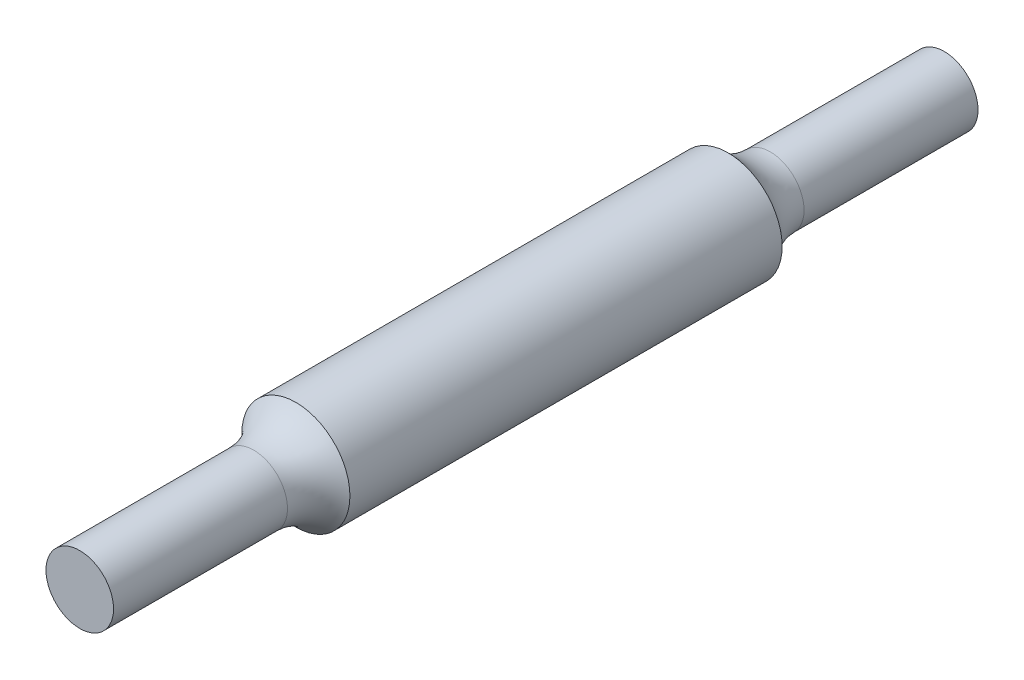
ISO-10303-21;
HEADER;
FILE_DESCRIPTION(('STEP AP214'),'2;1');
FILE_NAME('part.step','',(''),(''),'','','');
FILE_SCHEMA(('AUTOMOTIVE_DESIGN { 1 0 10303 214 1 1 1 1 }'));
ENDSEC;
DATA;
#1=APPLICATION_CONTEXT('core data for automotive mechanical design processes');
#2=APPLICATION_PROTOCOL_DEFINITION('international standard','automotive_design',2000,#1);
#3=PRODUCT_CONTEXT('',#1,'mechanical');
#4=PRODUCT('Part','Part','',(#3));
#5=PRODUCT_RELATED_PRODUCT_CATEGORY('part','',(#4));
#6=PRODUCT_DEFINITION_FORMATION('','',#4);
#7=PRODUCT_DEFINITION_CONTEXT('part definition',#1,'design');
#8=PRODUCT_DEFINITION('design','',#6,#7);
#9=PRODUCT_DEFINITION_SHAPE('','',#8);
#10=(LENGTH_UNIT() NAMED_UNIT(*) SI_UNIT(.MILLI.,.METRE.));
#11=(NAMED_UNIT(*) PLANE_ANGLE_UNIT() SI_UNIT($,.RADIAN.));
#12=(NAMED_UNIT(*) SI_UNIT($,.STERADIAN.) SOLID_ANGLE_UNIT());
#13=UNCERTAINTY_MEASURE_WITH_UNIT(LENGTH_MEASURE(1.E-05),#10,'distance_accuracy_value','');
#14=(GEOMETRIC_REPRESENTATION_CONTEXT(3) GLOBAL_UNCERTAINTY_ASSIGNED_CONTEXT((#13)) GLOBAL_UNIT_ASSIGNED_CONTEXT((#10,
#11,#12)) REPRESENTATION_CONTEXT('',''));
#15=CARTESIAN_POINT('',(0.,0.,0.));
#16=DIRECTION('',(0.,0.,1.));
#17=DIRECTION('',(1.,0.,0.));
#18=AXIS2_PLACEMENT_3D('',#15,#16,#17);
#19=CARTESIAN_POINT('',(0.,0.,25.4));
#20=DIRECTION('',(0.,0.,-1.));
#21=DIRECTION('',(-1.,0.,0.));
#22=AXIS2_PLACEMENT_3D('',#19,#20,#21);
#23=CYLINDRICAL_SURFACE('',#22,6.35);
#24=CARTESIAN_POINT('',(0.,0.,25.4));
#25=DIRECTION('',(0.,0.,1.));
#26=DIRECTION('',(1.,0.,0.));
#27=AXIS2_PLACEMENT_3D('',#24,#25,#26);
#28=CIRCLE('',#27,6.35);
#29=CARTESIAN_POINT('',(6.35,0.,25.4));
#30=VERTEX_POINT('',#29);
#31=EDGE_CURVE('E53',#30,#30,#28,.T.);
#32=ORIENTED_EDGE('',*,*,#31,.F.);
#33=EDGE_LOOP('',(#32));
#34=FACE_BOUND('',#33,.T.);
#35=CARTESIAN_POINT('',(0.,0.,-25.4));
#36=DIRECTION('',(0.,0.,1.));
#37=DIRECTION('',(1.,0.,0.));
#38=AXIS2_PLACEMENT_3D('',#35,#36,#37);
#39=CIRCLE('',#38,6.35);
#40=CARTESIAN_POINT('',(6.35,0.,-25.4));
#41=VERTEX_POINT('',#40);
#42=EDGE_CURVE('E57',#41,#41,#39,.T.);
#43=ORIENTED_EDGE('',*,*,#42,.T.);
#44=EDGE_LOOP('',(#43));
#45=FACE_BOUND('',#44,.T.);
#46=ADVANCED_FACE('F42',(#34,#45),#23,.T.);
#47=CARTESIAN_POINT('',(0.,0.,-50.8));
#48=DIRECTION('',(0.,0.,1.));
#49=DIRECTION('',(1.,0.,0.));
#50=AXIS2_PLACEMENT_3D('',#47,#48,#49);
#51=PLANE('',#50);
#52=CARTESIAN_POINT('',(0.,0.,-50.8));
#53=DIRECTION('',(0.,0.,1.));
#54=DIRECTION('',(1.,0.,0.));
#55=AXIS2_PLACEMENT_3D('',#52,#53,#54);
#56=CIRCLE('',#55,3.96875);
#57=CARTESIAN_POINT('',(3.96875,0.,-50.8));
#58=VERTEX_POINT('',#57);
#59=EDGE_CURVE('E63',#58,#58,#56,.T.);
#60=ORIENTED_EDGE('',*,*,#59,.F.);
#61=EDGE_LOOP('',(#60));
#62=FACE_BOUND('',#61,.T.);
#63=ADVANCED_FACE('F82',(#62),#51,.F.);
#64=CARTESIAN_POINT('',(0.,0.,50.8));
#65=DIRECTION('',(0.,0.,-1.));
#66=DIRECTION('',(-1.,0.,0.));
#67=AXIS2_PLACEMENT_3D('',#64,#65,#66);
#68=CYLINDRICAL_SURFACE('',#67,3.96875);
#69=CARTESIAN_POINT('',(0.,0.,-30.3569671612287));
#70=DIRECTION('',(0.,0.,1.));
#71=DIRECTION('',(1.,0.,0.));
#72=AXIS2_PLACEMENT_3D('',#69,#70,#71);
#73=CIRCLE('',#72,3.96875);
#74=CARTESIAN_POINT('',(3.96875,0.,-30.3569671612287));
#75=VERTEX_POINT('',#74);
#76=EDGE_CURVE('E49',#75,#75,#73,.F.);
#77=ORIENTED_EDGE('',*,*,#76,.T.);
#78=EDGE_LOOP('',(#77));
#79=FACE_BOUND('',#78,.T.);
#80=ORIENTED_EDGE('',*,*,#59,.T.);
#81=EDGE_LOOP('',(#80));
#82=FACE_BOUND('',#81,.T.);
#83=ADVANCED_FACE('F73',(#79,#82),#68,.T.);
#84=CARTESIAN_POINT('',(0.,0.,30.3569671612287));
#85=DIRECTION('',(0.,0.,-1.));
#86=DIRECTION('',(-1.,0.,0.));
#87=AXIS2_PLACEMENT_3D('',#84,#85,#86);
#88=CIRCLE('',#87,3.96875);
#89=CARTESIAN_POINT('',(-3.96875,0.,30.3569671612287));
#90=VERTEX_POINT('',#89);
#91=EDGE_CURVE('E10',#90,#90,#88,.F.);
#92=ORIENTED_EDGE('',*,*,#91,.T.);
#93=EDGE_LOOP('',(#92));
#94=FACE_BOUND('',#93,.T.);
#95=CARTESIAN_POINT('',(0.,0.,50.8));
#96=DIRECTION('',(0.,0.,1.));
#97=DIRECTION('',(1.,0.,0.));
#98=AXIS2_PLACEMENT_3D('',#95,#96,#97);
#99=CIRCLE('',#98,3.96875);
#100=CARTESIAN_POINT('',(3.96875,0.,50.8));
#101=VERTEX_POINT('',#100);
#102=EDGE_CURVE('E61',#101,#101,#99,.T.);
#103=ORIENTED_EDGE('',*,*,#102,.F.);
#104=EDGE_LOOP('',(#103));
#105=FACE_BOUND('',#104,.T.);
#106=ADVANCED_FACE('F71',(#94,#105),#68,.T.);
#107=CARTESIAN_POINT('',(0.,0.,50.8));
#108=DIRECTION('',(0.,0.,1.));
#109=DIRECTION('',(1.,0.,0.));
#110=AXIS2_PLACEMENT_3D('',#107,#108,#109);
#111=PLANE('',#110);
#112=ORIENTED_EDGE('',*,*,#102,.T.);
#113=EDGE_LOOP('',(#112));
#114=FACE_BOUND('',#113,.T.);
#115=ADVANCED_FACE('F69',(#114),#111,.T.);
#116=CARTESIAN_POINT('',(0.,0.,-30.3569671612287));
#117=DIRECTION('',(0.,0.,1.));
#118=DIRECTION('',(1.,0.,0.));
#119=AXIS2_PLACEMENT_3D('',#116,#117,#118);
#120=TOROIDAL_SURFACE('',#119,10.31875,6.35);
#121=ORIENTED_EDGE('',*,*,#42,.F.);
#122=EDGE_LOOP('',(#121));
#123=FACE_BOUND('',#122,.T.);
#124=ORIENTED_EDGE('',*,*,#76,.F.);
#125=EDGE_LOOP('',(#124));
#126=FACE_BOUND('',#125,.T.);
#127=ADVANCED_FACE('F80',(#123,#126),#120,.F.);
#128=CARTESIAN_POINT('',(0.,0.,30.3569671612287));
#129=DIRECTION('',(0.,0.,-1.));
#130=DIRECTION('',(-1.,0.,0.));
#131=AXIS2_PLACEMENT_3D('',#128,#129,#130);
#132=TOROIDAL_SURFACE('',#131,10.31875,6.35);
#133=ORIENTED_EDGE('',*,*,#91,.F.);
#134=EDGE_LOOP('',(#133));
#135=FACE_BOUND('',#134,.T.);
#136=ORIENTED_EDGE('',*,*,#31,.T.);
#137=EDGE_LOOP('',(#136));
#138=FACE_BOUND('',#137,.T.);
#139=ADVANCED_FACE('F44',(#135,#138),#132,.F.);
#140=CLOSED_SHELL('',(#46,#63,#83,#106,#115,#127,#139));
#141=MANIFOLD_SOLID_BREP('B2',#140);
#142=ADVANCED_BREP_SHAPE_REPRESENTATION('',(#18,#141),#14);
#143=SHAPE_DEFINITION_REPRESENTATION(#9,#142);
ENDSEC;
END-ISO-10303-21;
